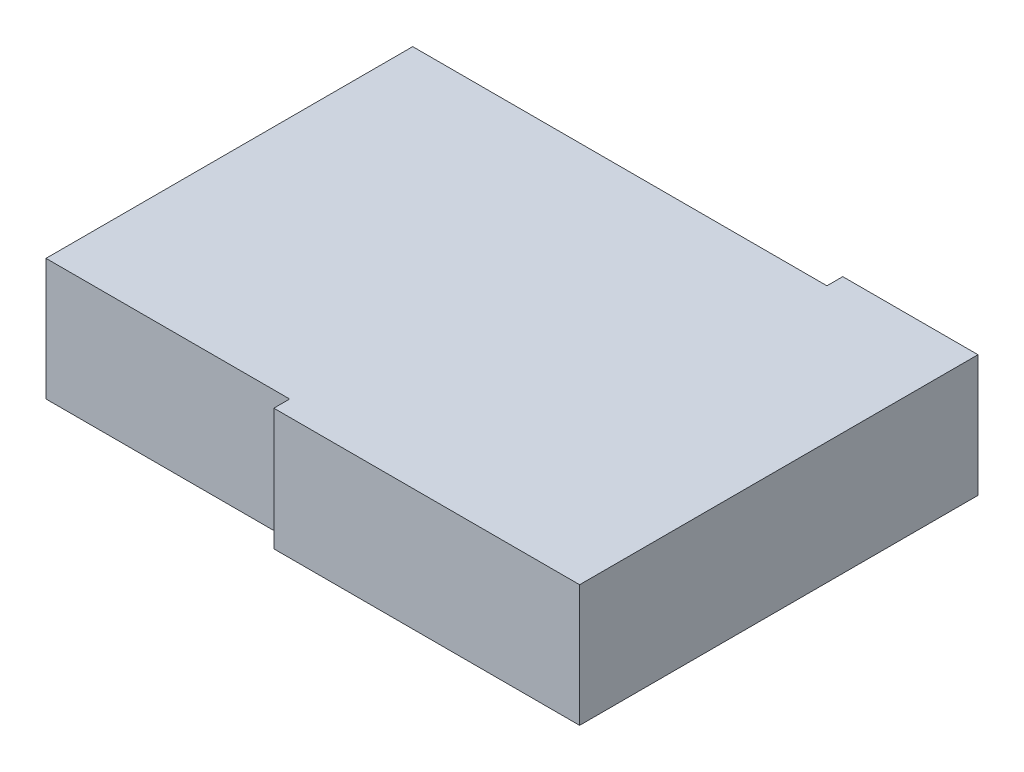
ISO-10303-21;
HEADER;
FILE_DESCRIPTION(('STEP AP214'),'2;1');
FILE_NAME('part.step','',(''),(''),'','','');
FILE_SCHEMA(('AUTOMOTIVE_DESIGN { 1 0 10303 214 1 1 1 1 }'));
ENDSEC;
DATA;
#1=APPLICATION_CONTEXT('core data for automotive mechanical design processes');
#2=APPLICATION_PROTOCOL_DEFINITION('international standard','automotive_design',2000,#1);
#3=PRODUCT_CONTEXT('',#1,'mechanical');
#4=PRODUCT('Part','Part','',(#3));
#5=PRODUCT_RELATED_PRODUCT_CATEGORY('part','',(#4));
#6=PRODUCT_DEFINITION_FORMATION('','',#4);
#7=PRODUCT_DEFINITION_CONTEXT('part definition',#1,'design');
#8=PRODUCT_DEFINITION('design','',#6,#7);
#9=PRODUCT_DEFINITION_SHAPE('','',#8);
#10=(LENGTH_UNIT() NAMED_UNIT(*) SI_UNIT(.MILLI.,.METRE.));
#11=(NAMED_UNIT(*) PLANE_ANGLE_UNIT() SI_UNIT($,.RADIAN.));
#12=(NAMED_UNIT(*) SI_UNIT($,.STERADIAN.) SOLID_ANGLE_UNIT());
#13=UNCERTAINTY_MEASURE_WITH_UNIT(LENGTH_MEASURE(1.E-05),#10,'distance_accuracy_value','');
#14=(GEOMETRIC_REPRESENTATION_CONTEXT(3) GLOBAL_UNCERTAINTY_ASSIGNED_CONTEXT((#13)) GLOBAL_UNIT_ASSIGNED_CONTEXT((#10,
#11,#12)) REPRESENTATION_CONTEXT('',''));
#15=CARTESIAN_POINT('',(0.,0.,0.));
#16=DIRECTION('',(0.,0.,1.));
#17=DIRECTION('',(1.,0.,0.));
#18=AXIS2_PLACEMENT_3D('',#15,#16,#17);
#19=CARTESIAN_POINT('',(0.,10.,0.2));
#20=DIRECTION('',(0.,0.,-1.));
#21=DIRECTION('',(-1.,0.,0.));
#22=AXIS2_PLACEMENT_3D('',#19,#20,#21);
#23=PLANE('',#22);
#24=DIRECTION('',(1.,0.,0.));
#25=VECTOR('',#24,1.);
#26=CARTESIAN_POINT('',(0.,0.,0.2));
#27=LINE('',#26,#25);
#28=CARTESIAN_POINT('',(0.2,0.,0.2));
#29=VERTEX_POINT('',#28);
#30=CARTESIAN_POINT('',(34.2,0.,0.2));
#31=VERTEX_POINT('',#30);
#32=EDGE_CURVE('E130',#29,#31,#27,.T.);
#33=ORIENTED_EDGE('',*,*,#32,.F.);
#34=DIRECTION('',(0.,-1.,0.));
#35=VECTOR('',#34,1.);
#36=CARTESIAN_POINT('',(0.2,10.,0.2));
#37=LINE('',#36,#35);
#38=CARTESIAN_POINT('',(0.2,10.,0.2));
#39=VERTEX_POINT('',#38);
#40=EDGE_CURVE('E11',#39,#29,#37,.T.);
#41=ORIENTED_EDGE('',*,*,#40,.F.);
#42=DIRECTION('',(1.,0.,0.));
#43=VECTOR('',#42,1.);
#44=CARTESIAN_POINT('',(0.,10.,0.2));
#45=LINE('',#44,#43);
#46=CARTESIAN_POINT('',(34.2,10.,0.2));
#47=VERTEX_POINT('',#46);
#48=EDGE_CURVE('E150',#39,#47,#45,.T.);
#49=ORIENTED_EDGE('',*,*,#48,.T.);
#50=DIRECTION('',(0.,-1.,0.));
#51=VECTOR('',#50,1.);
#52=CARTESIAN_POINT('',(34.2,10.,0.2));
#53=LINE('',#52,#51);
#54=EDGE_CURVE('E53',#47,#31,#53,.T.);
#55=ORIENTED_EDGE('',*,*,#54,.T.);
#56=EDGE_LOOP('',(#33,#41,#49,#55));
#57=FACE_BOUND('',#56,.T.);
#58=ADVANCED_FACE('F37',(#57),#23,.T.);
#59=CARTESIAN_POINT('',(0.2,10.,0.));
#60=DIRECTION('',(-1.,0.,0.));
#61=DIRECTION('',(0.,0.,1.));
#62=AXIS2_PLACEMENT_3D('',#59,#60,#61);
#63=PLANE('',#62);
#64=DIRECTION('',(0.,0.,-1.));
#65=VECTOR('',#64,1.);
#66=CARTESIAN_POINT('',(0.2,0.,0.));
#67=LINE('',#66,#65);
#68=CARTESIAN_POINT('',(0.2,0.,30.3));
#69=VERTEX_POINT('',#68);
#70=EDGE_CURVE('E132',#69,#29,#67,.T.);
#71=ORIENTED_EDGE('',*,*,#70,.F.);
#72=DIRECTION('',(0.,-1.,0.));
#73=VECTOR('',#72,1.);
#74=CARTESIAN_POINT('',(0.2,10.,30.3));
#75=LINE('',#74,#73);
#76=CARTESIAN_POINT('',(0.2,10.,30.3));
#77=VERTEX_POINT('',#76);
#78=EDGE_CURVE('E45',#77,#69,#75,.T.);
#79=ORIENTED_EDGE('',*,*,#78,.F.);
#80=DIRECTION('',(0.,0.,-1.));
#81=VECTOR('',#80,1.);
#82=CARTESIAN_POINT('',(0.2,10.,0.));
#83=LINE('',#82,#81);
#84=EDGE_CURVE('E176',#77,#39,#83,.T.);
#85=ORIENTED_EDGE('',*,*,#84,.T.);
#86=ORIENTED_EDGE('',*,*,#40,.T.);
#87=EDGE_LOOP('',(#71,#79,#85,#86));
#88=FACE_BOUND('',#87,.T.);
#89=ADVANCED_FACE('F167',(#88),#63,.T.);
#90=CARTESIAN_POINT('',(0.,10.,30.3));
#91=DIRECTION('',(0.,0.,1.));
#92=DIRECTION('',(1.,0.,0.));
#93=AXIS2_PLACEMENT_3D('',#90,#91,#92);
#94=PLANE('',#93);
#95=DIRECTION('',(-1.,0.,0.));
#96=VECTOR('',#95,1.);
#97=CARTESIAN_POINT('',(0.,0.,30.3));
#98=LINE('',#97,#96);
#99=CARTESIAN_POINT('',(20.2,0.,30.3));
#100=VERTEX_POINT('',#99);
#101=EDGE_CURVE('E135',#100,#69,#98,.T.);
#102=ORIENTED_EDGE('',*,*,#101,.F.);
#103=DIRECTION('',(0.,-1.,0.));
#104=VECTOR('',#103,1.);
#105=CARTESIAN_POINT('',(20.2,10.,30.3));
#106=LINE('',#105,#104);
#107=CARTESIAN_POINT('',(20.2,10.,30.3));
#108=VERTEX_POINT('',#107);
#109=EDGE_CURVE('E156',#108,#100,#106,.T.);
#110=ORIENTED_EDGE('',*,*,#109,.F.);
#111=DIRECTION('',(-1.,0.,0.));
#112=VECTOR('',#111,1.);
#113=CARTESIAN_POINT('',(0.,10.,30.3));
#114=LINE('',#113,#112);
#115=EDGE_CURVE('E163',#108,#77,#114,.T.);
#116=ORIENTED_EDGE('',*,*,#115,.T.);
#117=ORIENTED_EDGE('',*,*,#78,.T.);
#118=EDGE_LOOP('',(#102,#110,#116,#117));
#119=FACE_BOUND('',#118,.T.);
#120=ADVANCED_FACE('F161',(#119),#94,.T.);
#121=CARTESIAN_POINT('',(20.2,10.,0.));
#122=DIRECTION('',(-1.,0.,0.));
#123=DIRECTION('',(0.,0.,1.));
#124=AXIS2_PLACEMENT_3D('',#121,#122,#123);
#125=PLANE('',#124);
#126=DIRECTION('',(0.,0.,-1.));
#127=VECTOR('',#126,1.);
#128=CARTESIAN_POINT('',(20.2,0.,0.));
#129=LINE('',#128,#127);
#130=CARTESIAN_POINT('',(20.2,0.,31.6));
#131=VERTEX_POINT('',#130);
#132=EDGE_CURVE('E138',#131,#100,#129,.T.);
#133=ORIENTED_EDGE('',*,*,#132,.F.);
#134=DIRECTION('',(0.,-1.,0.));
#135=VECTOR('',#134,1.);
#136=CARTESIAN_POINT('',(20.2,10.,31.6));
#137=LINE('',#136,#135);
#138=CARTESIAN_POINT('',(20.2,10.,31.6));
#139=VERTEX_POINT('',#138);
#140=EDGE_CURVE('E154',#139,#131,#137,.T.);
#141=ORIENTED_EDGE('',*,*,#140,.F.);
#142=DIRECTION('',(0.,0.,-1.));
#143=VECTOR('',#142,1.);
#144=CARTESIAN_POINT('',(20.2,10.,0.));
#145=LINE('',#144,#143);
#146=EDGE_CURVE('E175',#139,#108,#145,.T.);
#147=ORIENTED_EDGE('',*,*,#146,.T.);
#148=ORIENTED_EDGE('',*,*,#109,.T.);
#149=EDGE_LOOP('',(#133,#141,#147,#148));
#150=FACE_BOUND('',#149,.T.);
#151=ADVANCED_FACE('F173',(#150),#125,.T.);
#152=CARTESIAN_POINT('',(0.,10.,31.6));
#153=DIRECTION('',(0.,0.,1.));
#154=DIRECTION('',(1.,0.,0.));
#155=AXIS2_PLACEMENT_3D('',#152,#153,#154);
#156=PLANE('',#155);
#157=DIRECTION('',(-1.,0.,0.));
#158=VECTOR('',#157,1.);
#159=CARTESIAN_POINT('',(0.,0.,31.6));
#160=LINE('',#159,#158);
#161=CARTESIAN_POINT('',(45.3,0.,31.6));
#162=VERTEX_POINT('',#161);
#163=EDGE_CURVE('E141',#162,#131,#160,.T.);
#164=ORIENTED_EDGE('',*,*,#163,.F.);
#165=DIRECTION('',(0.,-1.,0.));
#166=VECTOR('',#165,1.);
#167=CARTESIAN_POINT('',(45.3,10.,31.6));
#168=LINE('',#167,#166);
#169=CARTESIAN_POINT('',(45.3,10.,31.6));
#170=VERTEX_POINT('',#169);
#171=EDGE_CURVE('E112',#170,#162,#168,.T.);
#172=ORIENTED_EDGE('',*,*,#171,.F.);
#173=DIRECTION('',(-1.,0.,0.));
#174=VECTOR('',#173,1.);
#175=CARTESIAN_POINT('',(0.,10.,31.6));
#176=LINE('',#175,#174);
#177=EDGE_CURVE('E122',#170,#139,#176,.T.);
#178=ORIENTED_EDGE('',*,*,#177,.T.);
#179=ORIENTED_EDGE('',*,*,#140,.T.);
#180=EDGE_LOOP('',(#164,#172,#178,#179));
#181=FACE_BOUND('',#180,.T.);
#182=ADVANCED_FACE('F182',(#181),#156,.T.);
#183=CARTESIAN_POINT('',(45.3,10.,0.));
#184=DIRECTION('',(1.,0.,0.));
#185=DIRECTION('',(0.,0.,-1.));
#186=AXIS2_PLACEMENT_3D('',#183,#184,#185);
#187=PLANE('',#186);
#188=DIRECTION('',(0.,0.,1.));
#189=VECTOR('',#188,1.);
#190=CARTESIAN_POINT('',(45.3,0.,0.));
#191=LINE('',#190,#189);
#192=CARTESIAN_POINT('',(45.3,0.,-1.1));
#193=VERTEX_POINT('',#192);
#194=EDGE_CURVE('E108',#193,#162,#191,.T.);
#195=ORIENTED_EDGE('',*,*,#194,.F.);
#196=DIRECTION('',(0.,-1.,0.));
#197=VECTOR('',#196,1.);
#198=CARTESIAN_POINT('',(45.3,10.,-1.1));
#199=LINE('',#198,#197);
#200=CARTESIAN_POINT('',(45.3,10.,-1.1));
#201=VERTEX_POINT('',#200);
#202=EDGE_CURVE('E103',#201,#193,#199,.T.);
#203=ORIENTED_EDGE('',*,*,#202,.F.);
#204=DIRECTION('',(0.,0.,1.));
#205=VECTOR('',#204,1.);
#206=CARTESIAN_POINT('',(45.3,10.,0.));
#207=LINE('',#206,#205);
#208=EDGE_CURVE('E106',#201,#170,#207,.T.);
#209=ORIENTED_EDGE('',*,*,#208,.T.);
#210=ORIENTED_EDGE('',*,*,#171,.T.);
#211=EDGE_LOOP('',(#195,#203,#209,#210));
#212=FACE_BOUND('',#211,.T.);
#213=ADVANCED_FACE('F105',(#212),#187,.T.);
#214=CARTESIAN_POINT('',(0.,10.,-1.1));
#215=DIRECTION('',(0.,0.,-1.));
#216=DIRECTION('',(-1.,0.,0.));
#217=AXIS2_PLACEMENT_3D('',#214,#215,#216);
#218=PLANE('',#217);
#219=DIRECTION('',(1.,0.,0.));
#220=VECTOR('',#219,1.);
#221=CARTESIAN_POINT('',(0.,0.,-1.1));
#222=LINE('',#221,#220);
#223=CARTESIAN_POINT('',(34.2,0.,-1.1));
#224=VERTEX_POINT('',#223);
#225=EDGE_CURVE('E145',#224,#193,#222,.T.);
#226=ORIENTED_EDGE('',*,*,#225,.F.);
#227=DIRECTION('',(0.,-1.,0.));
#228=VECTOR('',#227,1.);
#229=CARTESIAN_POINT('',(34.2,10.,-1.1));
#230=LINE('',#229,#228);
#231=CARTESIAN_POINT('',(34.2,10.,-1.1));
#232=VERTEX_POINT('',#231);
#233=EDGE_CURVE('E78',#232,#224,#230,.T.);
#234=ORIENTED_EDGE('',*,*,#233,.F.);
#235=DIRECTION('',(1.,0.,0.));
#236=VECTOR('',#235,1.);
#237=CARTESIAN_POINT('',(0.,10.,-1.1));
#238=LINE('',#237,#236);
#239=EDGE_CURVE('E119',#232,#201,#238,.T.);
#240=ORIENTED_EDGE('',*,*,#239,.T.);
#241=ORIENTED_EDGE('',*,*,#202,.T.);
#242=EDGE_LOOP('',(#226,#234,#240,#241));
#243=FACE_BOUND('',#242,.T.);
#244=ADVANCED_FACE('F124',(#243),#218,.T.);
#245=CARTESIAN_POINT('',(34.2,10.,0.));
#246=DIRECTION('',(-1.,0.,0.));
#247=DIRECTION('',(0.,0.,1.));
#248=AXIS2_PLACEMENT_3D('',#245,#246,#247);
#249=PLANE('',#248);
#250=DIRECTION('',(0.,0.,-1.));
#251=VECTOR('',#250,1.);
#252=CARTESIAN_POINT('',(34.2,0.,0.));
#253=LINE('',#252,#251);
#254=EDGE_CURVE('E147',#31,#224,#253,.T.);
#255=ORIENTED_EDGE('',*,*,#254,.F.);
#256=ORIENTED_EDGE('',*,*,#54,.F.);
#257=DIRECTION('',(0.,0.,-1.));
#258=VECTOR('',#257,1.);
#259=CARTESIAN_POINT('',(34.2,10.,0.));
#260=LINE('',#259,#258);
#261=EDGE_CURVE('E125',#47,#232,#260,.T.);
#262=ORIENTED_EDGE('',*,*,#261,.T.);
#263=ORIENTED_EDGE('',*,*,#233,.T.);
#264=EDGE_LOOP('',(#255,#256,#262,#263));
#265=FACE_BOUND('',#264,.T.);
#266=ADVANCED_FACE('F183',(#265),#249,.T.);
#267=CARTESIAN_POINT('',(0.,10.,0.));
#268=DIRECTION('',(0.,1.,0.));
#269=DIRECTION('',(0.,0.,1.));
#270=AXIS2_PLACEMENT_3D('',#267,#268,#269);
#271=PLANE('',#270);
#272=ORIENTED_EDGE('',*,*,#48,.F.);
#273=ORIENTED_EDGE('',*,*,#84,.F.);
#274=ORIENTED_EDGE('',*,*,#115,.F.);
#275=ORIENTED_EDGE('',*,*,#146,.F.);
#276=ORIENTED_EDGE('',*,*,#177,.F.);
#277=ORIENTED_EDGE('',*,*,#208,.F.);
#278=ORIENTED_EDGE('',*,*,#239,.F.);
#279=ORIENTED_EDGE('',*,*,#261,.F.);
#280=EDGE_LOOP('',(#272,#273,#274,#275,#276,#277,#278,#279));
#281=FACE_BOUND('',#280,.T.);
#282=ADVANCED_FACE('F117',(#281),#271,.T.);
#283=CARTESIAN_POINT('',(0.,0.,0.));
#284=DIRECTION('',(0.,1.,0.));
#285=DIRECTION('',(0.,0.,1.));
#286=AXIS2_PLACEMENT_3D('',#283,#284,#285);
#287=PLANE('',#286);
#288=ORIENTED_EDGE('',*,*,#32,.T.);
#289=ORIENTED_EDGE('',*,*,#254,.T.);
#290=ORIENTED_EDGE('',*,*,#225,.T.);
#291=ORIENTED_EDGE('',*,*,#194,.T.);
#292=ORIENTED_EDGE('',*,*,#163,.T.);
#293=ORIENTED_EDGE('',*,*,#132,.T.);
#294=ORIENTED_EDGE('',*,*,#101,.T.);
#295=ORIENTED_EDGE('',*,*,#70,.T.);
#296=EDGE_LOOP('',(#288,#289,#290,#291,#292,#293,#294,#295));
#297=FACE_BOUND('',#296,.T.);
#298=ADVANCED_FACE('F169',(#297),#287,.F.);
#299=CLOSED_SHELL('',(#58,#89,#120,#151,#182,#213,#244,#266,#282,#298));
#300=MANIFOLD_SOLID_BREP('B2',#299);
#301=ADVANCED_BREP_SHAPE_REPRESENTATION('',(#18,#300),#14);
#302=SHAPE_DEFINITION_REPRESENTATION(#9,#301);
ENDSEC;
END-ISO-10303-21;
